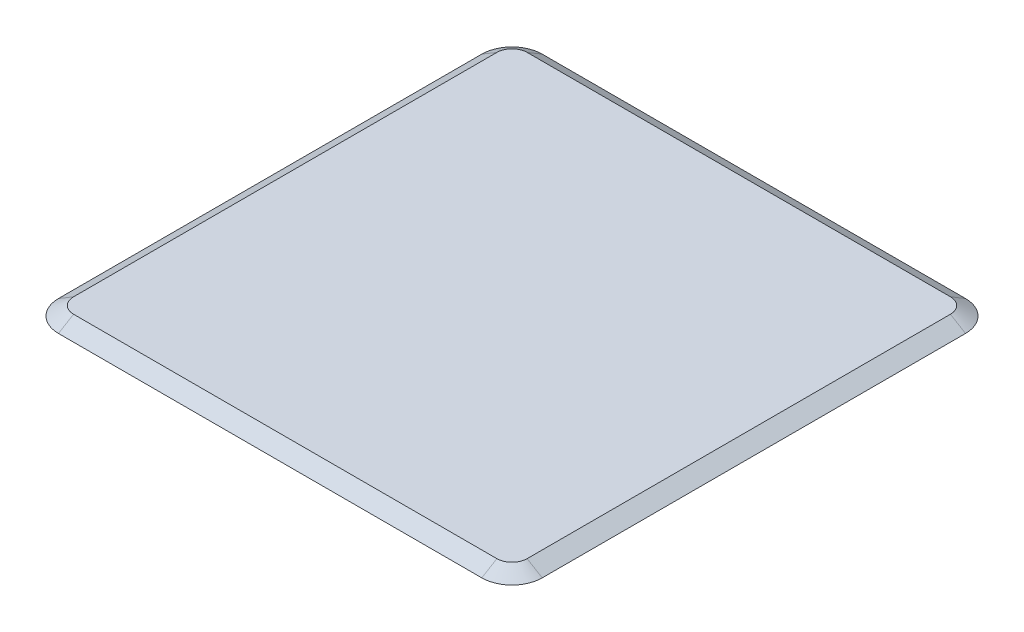
ISO-10303-21;
HEADER;
FILE_DESCRIPTION(('STEP AP214'),'2;1');
FILE_NAME('part.step','',(''),(''),'','','');
FILE_SCHEMA(('AUTOMOTIVE_DESIGN { 1 0 10303 214 1 1 1 1 }'));
ENDSEC;
DATA;
#1=APPLICATION_CONTEXT('core data for automotive mechanical design processes');
#2=APPLICATION_PROTOCOL_DEFINITION('international standard','automotive_design',2000,#1);
#3=PRODUCT_CONTEXT('',#1,'mechanical');
#4=PRODUCT('Part','Part','',(#3));
#5=PRODUCT_RELATED_PRODUCT_CATEGORY('part','',(#4));
#6=PRODUCT_DEFINITION_FORMATION('','',#4);
#7=PRODUCT_DEFINITION_CONTEXT('part definition',#1,'design');
#8=PRODUCT_DEFINITION('design','',#6,#7);
#9=PRODUCT_DEFINITION_SHAPE('','',#8);
#10=(LENGTH_UNIT() NAMED_UNIT(*) SI_UNIT(.MILLI.,.METRE.));
#11=(NAMED_UNIT(*) PLANE_ANGLE_UNIT() SI_UNIT($,.RADIAN.));
#12=(NAMED_UNIT(*) SI_UNIT($,.STERADIAN.) SOLID_ANGLE_UNIT());
#13=UNCERTAINTY_MEASURE_WITH_UNIT(LENGTH_MEASURE(1.E-05),#10,'distance_accuracy_value','');
#14=(GEOMETRIC_REPRESENTATION_CONTEXT(3) GLOBAL_UNCERTAINTY_ASSIGNED_CONTEXT((#13)) GLOBAL_UNIT_ASSIGNED_CONTEXT((#10,
#11,#12)) REPRESENTATION_CONTEXT('',''));
#15=CARTESIAN_POINT('',(0.,0.,0.));
#16=DIRECTION('',(0.,0.,1.));
#17=DIRECTION('',(1.,0.,0.));
#18=AXIS2_PLACEMENT_3D('',#15,#16,#17);
#19=CARTESIAN_POINT('',(35.,1.5,35.));
#20=DIRECTION('',(0.,1.,0.));
#21=DIRECTION('',(0.,0.,1.));
#22=AXIS2_PLACEMENT_3D('',#19,#20,#21);
#23=PLANE('',#22);
#24=DIRECTION('',(0.,0.,1.));
#25=VECTOR('',#24,1.);
#26=CARTESIAN_POINT('',(-37.5,1.5,35.));
#27=LINE('',#26,#25);
#28=CARTESIAN_POINT('',(-37.5,1.5,-35.));
#29=VERTEX_POINT('',#28);
#30=CARTESIAN_POINT('',(-37.5,1.5,35.));
#31=VERTEX_POINT('',#30);
#32=EDGE_CURVE('E44',#29,#31,#27,.T.);
#33=ORIENTED_EDGE('',*,*,#32,.T.);
#34=CARTESIAN_POINT('',(-35.,1.5,35.));
#35=DIRECTION('',(0.,1.,0.));
#36=DIRECTION('',(0.,0.,1.));
#37=AXIS2_PLACEMENT_3D('',#34,#35,#36);
#38=CIRCLE('',#37,2.5);
#39=CARTESIAN_POINT('',(-35.,1.5,37.5));
#40=VERTEX_POINT('',#39);
#41=EDGE_CURVE('E11',#31,#40,#38,.T.);
#42=ORIENTED_EDGE('',*,*,#41,.T.);
#43=DIRECTION('',(1.,0.,0.));
#44=VECTOR('',#43,1.);
#45=CARTESIAN_POINT('',(35.,1.5,37.5));
#46=LINE('',#45,#44);
#47=CARTESIAN_POINT('',(35.,1.5,37.5));
#48=VERTEX_POINT('',#47);
#49=EDGE_CURVE('E147',#40,#48,#46,.T.);
#50=ORIENTED_EDGE('',*,*,#49,.T.);
#51=CARTESIAN_POINT('',(35.,1.5,35.));
#52=DIRECTION('',(0.,1.,0.));
#53=DIRECTION('',(0.,0.,1.));
#54=AXIS2_PLACEMENT_3D('',#51,#52,#53);
#55=CIRCLE('',#54,2.5);
#56=CARTESIAN_POINT('',(37.5,1.5,35.));
#57=VERTEX_POINT('',#56);
#58=EDGE_CURVE('E145',#48,#57,#55,.T.);
#59=ORIENTED_EDGE('',*,*,#58,.T.);
#60=DIRECTION('',(0.,0.,-1.));
#61=VECTOR('',#60,1.);
#62=CARTESIAN_POINT('',(37.5,1.5,-35.));
#63=LINE('',#62,#61);
#64=CARTESIAN_POINT('',(37.5,1.5,-35.));
#65=VERTEX_POINT('',#64);
#66=EDGE_CURVE('E115',#57,#65,#63,.T.);
#67=ORIENTED_EDGE('',*,*,#66,.T.);
#68=CARTESIAN_POINT('',(35.,1.5,-35.));
#69=DIRECTION('',(0.,1.,0.));
#70=DIRECTION('',(0.,0.,1.));
#71=AXIS2_PLACEMENT_3D('',#68,#69,#70);
#72=CIRCLE('',#71,2.5);
#73=CARTESIAN_POINT('',(35.,1.5,-37.5));
#74=VERTEX_POINT('',#73);
#75=EDGE_CURVE('E149',#65,#74,#72,.T.);
#76=ORIENTED_EDGE('',*,*,#75,.T.);
#77=DIRECTION('',(-1.,0.,0.));
#78=VECTOR('',#77,1.);
#79=CARTESIAN_POINT('',(-35.,1.5,-37.5));
#80=LINE('',#79,#78);
#81=CARTESIAN_POINT('',(-35.,1.5,-37.5));
#82=VERTEX_POINT('',#81);
#83=EDGE_CURVE('E151',#74,#82,#80,.T.);
#84=ORIENTED_EDGE('',*,*,#83,.T.);
#85=CARTESIAN_POINT('',(-35.,1.5,-35.));
#86=DIRECTION('',(0.,1.,0.));
#87=DIRECTION('',(0.,0.,1.));
#88=AXIS2_PLACEMENT_3D('',#85,#86,#87);
#89=CIRCLE('',#88,2.5);
#90=EDGE_CURVE('E55',#82,#29,#89,.T.);
#91=ORIENTED_EDGE('',*,*,#90,.T.);
#92=EDGE_LOOP('',(#33,#42,#50,#59,#67,#76,#84,#91));
#93=FACE_BOUND('',#92,.T.);
#94=ADVANCED_FACE('F35',(#93),#23,.T.);
#95=CARTESIAN_POINT('',(35.,0.,35.));
#96=DIRECTION('',(0.,1.,0.));
#97=DIRECTION('',(0.,0.,1.));
#98=AXIS2_PLACEMENT_3D('',#95,#96,#97);
#99=PLANE('',#98);
#100=CARTESIAN_POINT('',(35.,0.,35.));
#101=DIRECTION('',(0.,1.,0.));
#102=DIRECTION('',(0.,0.,1.));
#103=AXIS2_PLACEMENT_3D('',#100,#101,#102);
#104=CIRCLE('',#103,5.);
#105=CARTESIAN_POINT('',(35.,0.,40.));
#106=VERTEX_POINT('',#105);
#107=CARTESIAN_POINT('',(40.,0.,35.));
#108=VERTEX_POINT('',#107);
#109=EDGE_CURVE('E103',#106,#108,#104,.T.);
#110=ORIENTED_EDGE('',*,*,#109,.F.);
#111=DIRECTION('',(1.,0.,0.));
#112=VECTOR('',#111,1.);
#113=CARTESIAN_POINT('',(-35.,0.,40.));
#114=LINE('',#113,#112);
#115=CARTESIAN_POINT('',(-35.,0.,40.));
#116=VERTEX_POINT('',#115);
#117=EDGE_CURVE('E142',#116,#106,#114,.T.);
#118=ORIENTED_EDGE('',*,*,#117,.F.);
#119=CARTESIAN_POINT('',(-35.,0.,35.));
#120=DIRECTION('',(0.,1.,0.));
#121=DIRECTION('',(0.,0.,-1.));
#122=AXIS2_PLACEMENT_3D('',#119,#120,#121);
#123=CIRCLE('',#122,5.);
#124=CARTESIAN_POINT('',(-40.,0.,35.));
#125=VERTEX_POINT('',#124);
#126=EDGE_CURVE('E139',#125,#116,#123,.T.);
#127=ORIENTED_EDGE('',*,*,#126,.F.);
#128=DIRECTION('',(0.,0.,1.));
#129=VECTOR('',#128,1.);
#130=CARTESIAN_POINT('',(-40.,0.,-35.));
#131=LINE('',#130,#129);
#132=CARTESIAN_POINT('',(-40.,0.,-35.));
#133=VERTEX_POINT('',#132);
#134=EDGE_CURVE('E136',#133,#125,#131,.T.);
#135=ORIENTED_EDGE('',*,*,#134,.F.);
#136=CARTESIAN_POINT('',(-35.,0.,-35.));
#137=DIRECTION('',(0.,1.,0.));
#138=DIRECTION('',(0.,0.,-1.));
#139=AXIS2_PLACEMENT_3D('',#136,#137,#138);
#140=CIRCLE('',#139,5.);
#141=CARTESIAN_POINT('',(-35.,0.,-40.));
#142=VERTEX_POINT('',#141);
#143=EDGE_CURVE('E133',#142,#133,#140,.T.);
#144=ORIENTED_EDGE('',*,*,#143,.F.);
#145=DIRECTION('',(-1.,0.,0.));
#146=VECTOR('',#145,1.);
#147=CARTESIAN_POINT('',(-35.,0.,-40.));
#148=LINE('',#147,#146);
#149=CARTESIAN_POINT('',(35.,0.,-40.));
#150=VERTEX_POINT('',#149);
#151=EDGE_CURVE('E130',#150,#142,#148,.T.);
#152=ORIENTED_EDGE('',*,*,#151,.F.);
#153=CARTESIAN_POINT('',(35.,0.,-35.));
#154=DIRECTION('',(0.,1.,0.));
#155=DIRECTION('',(0.,0.,1.));
#156=AXIS2_PLACEMENT_3D('',#153,#154,#155);
#157=CIRCLE('',#156,5.);
#158=CARTESIAN_POINT('',(40.,0.,-35.));
#159=VERTEX_POINT('',#158);
#160=EDGE_CURVE('E106',#159,#150,#157,.T.);
#161=ORIENTED_EDGE('',*,*,#160,.F.);
#162=DIRECTION('',(0.,0.,-1.));
#163=VECTOR('',#162,1.);
#164=CARTESIAN_POINT('',(40.,0.,-35.));
#165=LINE('',#164,#163);
#166=EDGE_CURVE('E99',#108,#159,#165,.T.);
#167=ORIENTED_EDGE('',*,*,#166,.F.);
#168=EDGE_LOOP('',(#110,#118,#127,#135,#144,#152,#161,#167));
#169=FACE_BOUND('',#168,.T.);
#170=ADVANCED_FACE('F101',(#169),#99,.F.);
#171=CARTESIAN_POINT('',(35.,1.5,-35.));
#172=DIRECTION('',(0.,-1.,0.));
#173=DIRECTION('',(0.,0.,-1.));
#174=AXIS2_PLACEMENT_3D('',#171,#172,#173);
#175=CONICAL_SURFACE('',#174,2.5,1.03037682652431);
#176=DIRECTION('',(-0.857492925712544,0.514495755427527,0.));
#177=VECTOR('',#176,1.);
#178=CARTESIAN_POINT('',(40.,0.,-35.));
#179=LINE('',#178,#177);
#180=EDGE_CURVE('E127',#159,#65,#179,.T.);
#181=ORIENTED_EDGE('',*,*,#180,.F.);
#182=ORIENTED_EDGE('',*,*,#160,.T.);
#183=DIRECTION('',(0.,-0.514495755427527,-0.857492925712544));
#184=VECTOR('',#183,1.);
#185=CARTESIAN_POINT('',(35.,1.5,-37.5));
#186=LINE('',#185,#184);
#187=EDGE_CURVE('E39',#74,#150,#186,.T.);
#188=ORIENTED_EDGE('',*,*,#187,.F.);
#189=ORIENTED_EDGE('',*,*,#75,.F.);
#190=EDGE_LOOP('',(#181,#182,#188,#189));
#191=FACE_BOUND('',#190,.T.);
#192=ADVANCED_FACE('F37',(#191),#175,.T.);
#193=CARTESIAN_POINT('',(35.,1.5,-37.5));
#194=DIRECTION('',(0.,0.857492925712544,-0.514495755427528));
#195=DIRECTION('',(1.,0.,0.));
#196=AXIS2_PLACEMENT_3D('',#193,#194,#195);
#197=PLANE('',#196);
#198=ORIENTED_EDGE('',*,*,#187,.T.);
#199=ORIENTED_EDGE('',*,*,#151,.T.);
#200=DIRECTION('',(0.,-0.514495755427528,-0.857492925712544));
#201=VECTOR('',#200,1.);
#202=CARTESIAN_POINT('',(-35.,1.5,-37.5));
#203=LINE('',#202,#201);
#204=EDGE_CURVE('E118',#82,#142,#203,.T.);
#205=ORIENTED_EDGE('',*,*,#204,.F.);
#206=ORIENTED_EDGE('',*,*,#83,.F.);
#207=EDGE_LOOP('',(#198,#199,#205,#206));
#208=FACE_BOUND('',#207,.T.);
#209=ADVANCED_FACE('F181',(#208),#197,.T.);
#210=CARTESIAN_POINT('',(37.5,1.5,35.));
#211=DIRECTION('',(0.514495755427527,0.857492925712544,0.));
#212=DIRECTION('',(0.,0.,1.));
#213=AXIS2_PLACEMENT_3D('',#210,#211,#212);
#214=PLANE('',#213);
#215=ORIENTED_EDGE('',*,*,#180,.T.);
#216=ORIENTED_EDGE('',*,*,#66,.F.);
#217=DIRECTION('',(-0.857492925712544,0.514495755427527,0.));
#218=VECTOR('',#217,1.);
#219=CARTESIAN_POINT('',(40.,0.,35.));
#220=LINE('',#219,#218);
#221=EDGE_CURVE('E113',#108,#57,#220,.T.);
#222=ORIENTED_EDGE('',*,*,#221,.F.);
#223=ORIENTED_EDGE('',*,*,#166,.T.);
#224=EDGE_LOOP('',(#215,#216,#222,#223));
#225=FACE_BOUND('',#224,.T.);
#226=ADVANCED_FACE('F114',(#225),#214,.T.);
#227=CARTESIAN_POINT('',(-35.,1.5,-35.));
#228=DIRECTION('',(0.,-1.,0.));
#229=DIRECTION('',(0.,0.,-1.));
#230=AXIS2_PLACEMENT_3D('',#227,#228,#229);
#231=CONICAL_SURFACE('',#230,2.5,1.03037682652431);
#232=ORIENTED_EDGE('',*,*,#204,.T.);
#233=ORIENTED_EDGE('',*,*,#143,.T.);
#234=DIRECTION('',(-0.857492925712544,-0.514495755427527,0.));
#235=VECTOR('',#234,1.);
#236=CARTESIAN_POINT('',(-37.5,1.5,-35.));
#237=LINE('',#236,#235);
#238=EDGE_CURVE('E119',#29,#133,#237,.T.);
#239=ORIENTED_EDGE('',*,*,#238,.F.);
#240=ORIENTED_EDGE('',*,*,#90,.F.);
#241=EDGE_LOOP('',(#232,#233,#239,#240));
#242=FACE_BOUND('',#241,.T.);
#243=ADVANCED_FACE('F179',(#242),#231,.T.);
#244=CARTESIAN_POINT('',(35.,1.5,35.));
#245=DIRECTION('',(0.,-1.,0.));
#246=DIRECTION('',(0.,0.,-1.));
#247=AXIS2_PLACEMENT_3D('',#244,#245,#246);
#248=CONICAL_SURFACE('',#247,2.5,1.03037682652431);
#249=ORIENTED_EDGE('',*,*,#221,.T.);
#250=ORIENTED_EDGE('',*,*,#58,.F.);
#251=DIRECTION('',(0.,0.514495755427527,-0.857492925712544));
#252=VECTOR('',#251,1.);
#253=CARTESIAN_POINT('',(35.,0.,40.));
#254=LINE('',#253,#252);
#255=EDGE_CURVE('E123',#106,#48,#254,.T.);
#256=ORIENTED_EDGE('',*,*,#255,.F.);
#257=ORIENTED_EDGE('',*,*,#109,.T.);
#258=EDGE_LOOP('',(#249,#250,#256,#257));
#259=FACE_BOUND('',#258,.T.);
#260=ADVANCED_FACE('F121',(#259),#248,.T.);
#261=CARTESIAN_POINT('',(-37.5,1.5,35.));
#262=DIRECTION('',(-0.514495755427527,0.857492925712544,0.));
#263=DIRECTION('',(0.,0.,-1.));
#264=AXIS2_PLACEMENT_3D('',#261,#262,#263);
#265=PLANE('',#264);
#266=ORIENTED_EDGE('',*,*,#238,.T.);
#267=ORIENTED_EDGE('',*,*,#134,.T.);
#268=DIRECTION('',(-0.857492925712544,-0.514495755427527,0.));
#269=VECTOR('',#268,1.);
#270=CARTESIAN_POINT('',(-37.5,1.5,35.));
#271=LINE('',#270,#269);
#272=EDGE_CURVE('E157',#31,#125,#271,.T.);
#273=ORIENTED_EDGE('',*,*,#272,.F.);
#274=ORIENTED_EDGE('',*,*,#32,.F.);
#275=EDGE_LOOP('',(#266,#267,#273,#274));
#276=FACE_BOUND('',#275,.T.);
#277=ADVANCED_FACE('F177',(#276),#265,.T.);
#278=CARTESIAN_POINT('',(35.,1.5,37.5));
#279=DIRECTION('',(0.,0.857492925712544,0.514495755427527));
#280=DIRECTION('',(-1.,0.,0.));
#281=AXIS2_PLACEMENT_3D('',#278,#279,#280);
#282=PLANE('',#281);
#283=ORIENTED_EDGE('',*,*,#255,.T.);
#284=ORIENTED_EDGE('',*,*,#49,.F.);
#285=DIRECTION('',(0.,0.514495755427527,-0.857492925712544));
#286=VECTOR('',#285,1.);
#287=CARTESIAN_POINT('',(-35.,0.,40.));
#288=LINE('',#287,#286);
#289=EDGE_CURVE('E155',#116,#40,#288,.T.);
#290=ORIENTED_EDGE('',*,*,#289,.F.);
#291=ORIENTED_EDGE('',*,*,#117,.T.);
#292=EDGE_LOOP('',(#283,#284,#290,#291));
#293=FACE_BOUND('',#292,.T.);
#294=ADVANCED_FACE('F170',(#293),#282,.T.);
#295=CARTESIAN_POINT('',(-35.,1.5,35.));
#296=DIRECTION('',(0.,-1.,0.));
#297=DIRECTION('',(0.,0.,-1.));
#298=AXIS2_PLACEMENT_3D('',#295,#296,#297);
#299=CONICAL_SURFACE('',#298,2.5,1.03037682652431);
#300=ORIENTED_EDGE('',*,*,#272,.T.);
#301=ORIENTED_EDGE('',*,*,#126,.T.);
#302=ORIENTED_EDGE('',*,*,#289,.T.);
#303=ORIENTED_EDGE('',*,*,#41,.F.);
#304=EDGE_LOOP('',(#300,#301,#302,#303));
#305=FACE_BOUND('',#304,.T.);
#306=ADVANCED_FACE('F174',(#305),#299,.T.);
#307=CLOSED_SHELL('',(#94,#170,#192,#209,#226,#243,#260,#277,#294,#306));
#308=MANIFOLD_SOLID_BREP('B2',#307);
#309=ADVANCED_BREP_SHAPE_REPRESENTATION('',(#18,#308),#14);
#310=SHAPE_DEFINITION_REPRESENTATION(#9,#309);
ENDSEC;
END-ISO-10303-21;
